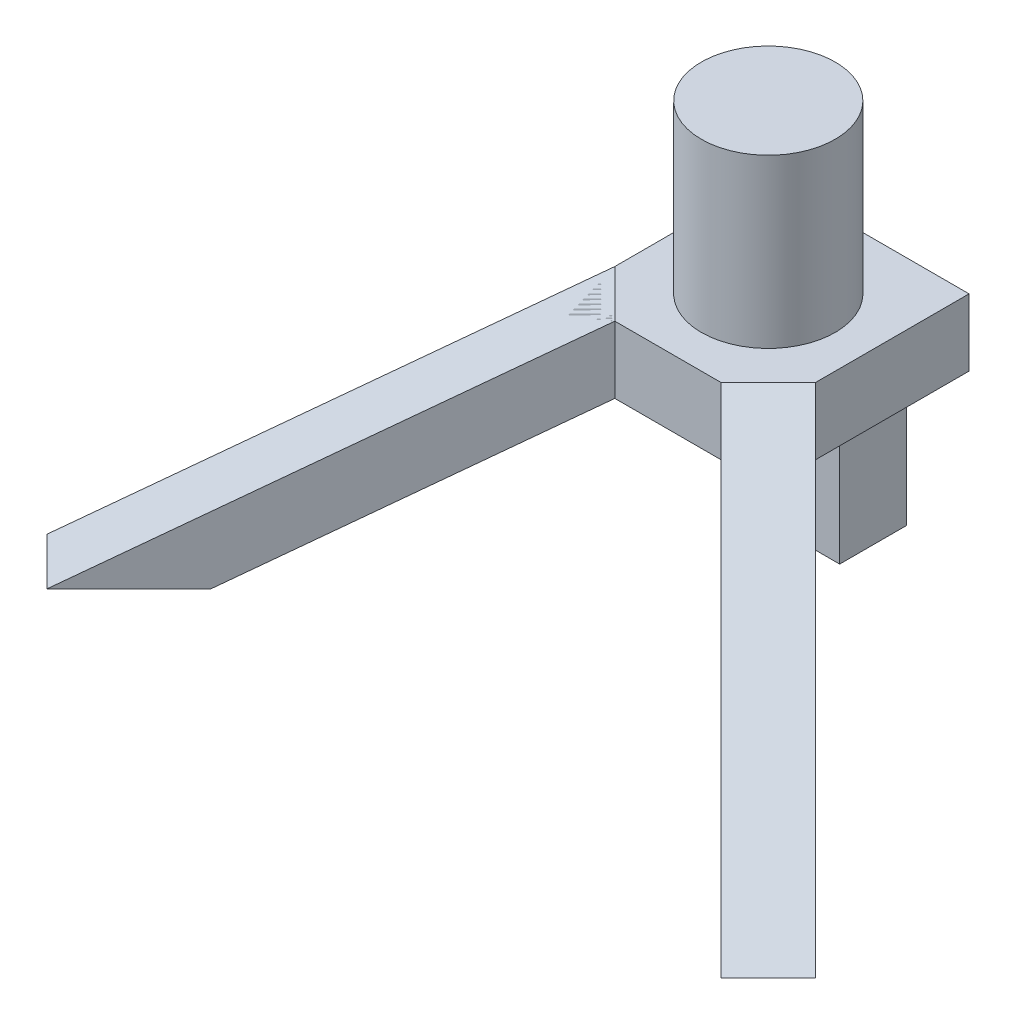
ISO-10303-21;
HEADER;
FILE_DESCRIPTION(('STEP AP214'),'2;1');
FILE_NAME('part.step','',(''),(''),'','','');
FILE_SCHEMA(('AUTOMOTIVE_DESIGN { 1 0 10303 214 1 1 1 1 }'));
ENDSEC;
DATA;
#1=APPLICATION_CONTEXT('core data for automotive mechanical design processes');
#2=APPLICATION_PROTOCOL_DEFINITION('international standard','automotive_design',2000,#1);
#3=PRODUCT_CONTEXT('',#1,'mechanical');
#4=PRODUCT('Part','Part','',(#3));
#5=PRODUCT_RELATED_PRODUCT_CATEGORY('part','',(#4));
#6=PRODUCT_DEFINITION_FORMATION('','',#4);
#7=PRODUCT_DEFINITION_CONTEXT('part definition',#1,'design');
#8=PRODUCT_DEFINITION('design','',#6,#7);
#9=PRODUCT_DEFINITION_SHAPE('','',#8);
#10=(LENGTH_UNIT() NAMED_UNIT(*) SI_UNIT(.MILLI.,.METRE.));
#11=(NAMED_UNIT(*) PLANE_ANGLE_UNIT() SI_UNIT($,.RADIAN.));
#12=(NAMED_UNIT(*) SI_UNIT($,.STERADIAN.) SOLID_ANGLE_UNIT());
#13=UNCERTAINTY_MEASURE_WITH_UNIT(LENGTH_MEASURE(1.E-05),#10,'distance_accuracy_value','');
#14=(GEOMETRIC_REPRESENTATION_CONTEXT(3) GLOBAL_UNCERTAINTY_ASSIGNED_CONTEXT((#13)) GLOBAL_UNIT_ASSIGNED_CONTEXT((#10,
#11,#12)) REPRESENTATION_CONTEXT('',''));
#15=CARTESIAN_POINT('',(0.,0.,0.));
#16=DIRECTION('',(0.,0.,1.));
#17=DIRECTION('',(1.,0.,0.));
#18=AXIS2_PLACEMENT_3D('',#15,#16,#17);
#19=CARTESIAN_POINT('',(-30.,20.,15.857864376269));
#20=DIRECTION('',(-0.707106781186547,0.,0.707106781186548));
#21=DIRECTION('',(0.707106781186548,0.,0.707106781186547));
#22=AXIS2_PLACEMENT_3D('',#19,#20,#21);
#23=PLANE('',#22);
#24=DIRECTION('',(0.707106781186548,0.,0.707106781186547));
#25=VECTOR('',#24,1.);
#26=CARTESIAN_POINT('',(-30.,20.,15.857864376269));
#27=LINE('',#26,#25);
#28=CARTESIAN_POINT('',(-30.,20.,15.857864376269));
#29=VERTEX_POINT('',#28);
#30=CARTESIAN_POINT('',(-15.857864376269,20.,30.));
#31=VERTEX_POINT('',#30);
#32=EDGE_CURVE('E71',#29,#31,#27,.T.);
#33=ORIENTED_EDGE('',*,*,#32,.T.);
#34=DIRECTION('',(0.,-1.,0.));
#35=VECTOR('',#34,1.);
#36=CARTESIAN_POINT('',(-15.857864376269,20.,30.));
#37=LINE('',#36,#35);
#38=CARTESIAN_POINT('',(-15.857864376269,0.,30.));
#39=VERTEX_POINT('',#38);
#40=EDGE_CURVE('E111',#31,#39,#37,.T.);
#41=ORIENTED_EDGE('',*,*,#40,.T.);
#42=DIRECTION('',(0.707106781186548,0.,0.707106781186547));
#43=VECTOR('',#42,1.);
#44=CARTESIAN_POINT('',(-30.,0.,15.857864376269));
#45=LINE('',#44,#43);
#46=CARTESIAN_POINT('',(-30.,0.,15.857864376269));
#47=VERTEX_POINT('',#46);
#48=EDGE_CURVE('E12',#47,#39,#45,.T.);
#49=ORIENTED_EDGE('',*,*,#48,.F.);
#50=DIRECTION('',(0.,-1.,0.));
#51=VECTOR('',#50,1.);
#52=CARTESIAN_POINT('',(-30.,20.,15.857864376269));
#53=LINE('',#52,#51);
#54=EDGE_CURVE('E119',#29,#47,#53,.T.);
#55=ORIENTED_EDGE('',*,*,#54,.F.);
#56=EDGE_LOOP('',(#33,#41,#49,#55));
#57=FACE_BOUND('',#56,.T.);
#58=ADVANCED_FACE('F57',(#57),#23,.F.);
#59=CARTESIAN_POINT('',(-30.,0.,15.857864376269));
#60=DIRECTION('',(-0.353553390593272,0.86602540378444,0.353553390593273));
#61=DIRECTION('',(0.,-0.377964473009226,0.925820099772552));
#62=AXIS2_PLACEMENT_3D('',#59,#60,#61);
#63=PLANE('',#62);
#64=ORIENTED_EDGE('',*,*,#48,.T.);
#65=DIRECTION('',(-0.612372435695795,-0.499999999999998,0.612372435695796));
#66=VECTOR('',#65,1.);
#67=CARTESIAN_POINT('',(-15.857864376269,0.,30.));
#68=LINE('',#67,#66);
#69=CARTESIAN_POINT('',(-76.2157806908228,-49.2820323027547,90.3579163145538));
#70=VERTEX_POINT('',#69);
#71=EDGE_CURVE('E101',#39,#70,#68,.T.);
#72=ORIENTED_EDGE('',*,*,#71,.T.);
#73=DIRECTION('',(0.707106781186548,0.,0.707106781186547));
#74=VECTOR('',#73,1.);
#75=CARTESIAN_POINT('',(-90.3579163145537,-49.2820323027547,76.2157806908229));
#76=LINE('',#75,#74);
#77=CARTESIAN_POINT('',(-90.3579163145537,-49.2820323027547,76.2157806908229));
#78=VERTEX_POINT('',#77);
#79=EDGE_CURVE('E64',#78,#70,#76,.T.);
#80=ORIENTED_EDGE('',*,*,#79,.F.);
#81=DIRECTION('',(-0.612372435695795,-0.499999999999998,0.612372435695796));
#82=VECTOR('',#81,1.);
#83=CARTESIAN_POINT('',(-30.,0.,15.857864376269));
#84=LINE('',#83,#82);
#85=EDGE_CURVE('E102',#47,#78,#84,.T.);
#86=ORIENTED_EDGE('',*,*,#85,.F.);
#87=EDGE_LOOP('',(#64,#72,#80,#86));
#88=FACE_BOUND('',#87,.T.);
#89=ADVANCED_FACE('F99',(#88),#63,.F.);
#90=CARTESIAN_POINT('',(-114.852813742386,-49.2820323027547,100.710678118655));
#91=DIRECTION('',(0.,-1.,0.));
#92=DIRECTION('',(0.,0.,-1.));
#93=AXIS2_PLACEMENT_3D('',#90,#91,#92);
#94=PLANE('',#93);
#95=ORIENTED_EDGE('',*,*,#79,.T.);
#96=DIRECTION('',(0.707106781186547,0.,-0.707106781186548));
#97=VECTOR('',#96,1.);
#98=CARTESIAN_POINT('',(-100.710678118655,-49.2820323027547,114.852813742386));
#99=LINE('',#98,#97);
#100=CARTESIAN_POINT('',(-100.710678118655,-49.2820323027547,114.852813742386));
#101=VERTEX_POINT('',#100);
#102=EDGE_CURVE('E112',#101,#70,#99,.T.);
#103=ORIENTED_EDGE('',*,*,#102,.F.);
#104=DIRECTION('',(0.707106781186548,0.,0.707106781186547));
#105=VECTOR('',#104,1.);
#106=CARTESIAN_POINT('',(-114.852813742386,-49.2820323027547,100.710678118655));
#107=LINE('',#106,#105);
#108=CARTESIAN_POINT('',(-114.852813742386,-49.2820323027547,100.710678118655));
#109=VERTEX_POINT('',#108);
#110=EDGE_CURVE('E79',#109,#101,#107,.T.);
#111=ORIENTED_EDGE('',*,*,#110,.F.);
#112=DIRECTION('',(0.707106781186547,0.,-0.707106781186548));
#113=VECTOR('',#112,1.);
#114=CARTESIAN_POINT('',(-114.852813742386,-49.2820323027547,100.710678118655));
#115=LINE('',#114,#113);
#116=EDGE_CURVE('E122',#109,#78,#115,.T.);
#117=ORIENTED_EDGE('',*,*,#116,.T.);
#118=EDGE_LOOP('',(#95,#103,#111,#117));
#119=FACE_BOUND('',#118,.T.);
#120=ADVANCED_FACE('F127',(#119),#94,.T.);
#121=CARTESIAN_POINT('',(-30.,20.,15.857864376269));
#122=DIRECTION('',(-0.353553390593272,0.86602540378444,0.353553390593273));
#123=DIRECTION('',(0.,-0.377964473009226,0.925820099772552));
#124=AXIS2_PLACEMENT_3D('',#121,#122,#123);
#125=PLANE('',#124);
#126=ORIENTED_EDGE('',*,*,#110,.T.);
#127=DIRECTION('',(-0.612372435695795,-0.499999999999998,0.612372435695796));
#128=VECTOR('',#127,1.);
#129=CARTESIAN_POINT('',(-15.857864376269,20.,30.));
#130=LINE('',#129,#128);
#131=EDGE_CURVE('E117',#31,#101,#130,.T.);
#132=ORIENTED_EDGE('',*,*,#131,.F.);
#133=ORIENTED_EDGE('',*,*,#32,.F.);
#134=DIRECTION('',(-0.612372435695795,-0.499999999999998,0.612372435695796));
#135=VECTOR('',#134,1.);
#136=CARTESIAN_POINT('',(-30.,20.,15.857864376269));
#137=LINE('',#136,#135);
#138=EDGE_CURVE('E124',#29,#109,#137,.T.);
#139=ORIENTED_EDGE('',*,*,#138,.T.);
#140=EDGE_LOOP('',(#126,#132,#133,#139));
#141=FACE_BOUND('',#140,.T.);
#142=ADVANCED_FACE('F131',(#141),#125,.T.);
#143=CARTESIAN_POINT('',(-7.07106781186547,0.,-7.07106781186547));
#144=DIRECTION('',(0.707106781186548,0.,0.707106781186547));
#145=DIRECTION('',(0.707106781186547,0.,-0.707106781186548));
#146=AXIS2_PLACEMENT_3D('',#143,#144,#145);
#147=PLANE('',#146);
#148=ORIENTED_EDGE('',*,*,#54,.T.);
#149=ORIENTED_EDGE('',*,*,#85,.T.);
#150=ORIENTED_EDGE('',*,*,#116,.F.);
#151=ORIENTED_EDGE('',*,*,#138,.F.);
#152=EDGE_LOOP('',(#148,#149,#150,#151));
#153=FACE_BOUND('',#152,.T.);
#154=ADVANCED_FACE('F130',(#153),#147,.F.);
#155=CARTESIAN_POINT('',(7.07106781186548,0.,7.07106781186548));
#156=DIRECTION('',(0.707106781186548,0.,0.707106781186547));
#157=DIRECTION('',(0.707106781186547,0.,-0.707106781186548));
#158=AXIS2_PLACEMENT_3D('',#155,#156,#157);
#159=PLANE('',#158);
#160=ORIENTED_EDGE('',*,*,#40,.F.);
#161=ORIENTED_EDGE('',*,*,#131,.T.);
#162=ORIENTED_EDGE('',*,*,#102,.T.);
#163=ORIENTED_EDGE('',*,*,#71,.F.);
#164=EDGE_LOOP('',(#160,#161,#162,#163));
#165=FACE_BOUND('',#164,.T.);
#166=ADVANCED_FACE('F109',(#165),#159,.T.);
#167=CLOSED_SHELL('',(#58,#89,#120,#142,#154,#166));
#168=MANIFOLD_SOLID_BREP('B2',#167);
#169=CARTESIAN_POINT('',(0.,0.,0.));
#170=DIRECTION('',(0.,1.,0.));
#171=DIRECTION('',(0.,0.,1.));
#172=AXIS2_PLACEMENT_3D('',#169,#170,#171);
#173=PLANE('',#172);
#174=DIRECTION('',(0.,0.,-1.));
#175=VECTOR('',#174,1.);
#176=CARTESIAN_POINT('',(-8.66595206494777,0.,-30.));
#177=LINE('',#176,#175);
#178=CARTESIAN_POINT('',(-8.66595206494777,0.,-10.));
#179=VERTEX_POINT('',#178);
#180=CARTESIAN_POINT('',(-8.66595206494777,0.,-30.));
#181=VERTEX_POINT('',#180);
#182=EDGE_CURVE('E198',#179,#181,#177,.T.);
#183=ORIENTED_EDGE('',*,*,#182,.F.);
#184=DIRECTION('',(-1.,0.,0.));
#185=VECTOR('',#184,1.);
#186=CARTESIAN_POINT('',(-8.66595206494777,0.,-10.));
#187=LINE('',#186,#185);
#188=CARTESIAN_POINT('',(11.3340479350522,0.,-10.));
#189=VERTEX_POINT('',#188);
#190=EDGE_CURVE('E203',#189,#179,#187,.T.);
#191=ORIENTED_EDGE('',*,*,#190,.F.);
#192=DIRECTION('',(0.,0.,1.));
#193=VECTOR('',#192,1.);
#194=CARTESIAN_POINT('',(11.3340479350522,0.,-30.));
#195=LINE('',#194,#193);
#196=CARTESIAN_POINT('',(11.3340479350522,0.,-30.));
#197=VERTEX_POINT('',#196);
#198=EDGE_CURVE('E278',#197,#189,#195,.T.);
#199=ORIENTED_EDGE('',*,*,#198,.F.);
#200=DIRECTION('',(1.,0.,0.));
#201=VECTOR('',#200,1.);
#202=CARTESIAN_POINT('',(0.,0.,-30.));
#203=LINE('',#202,#201);
#204=CARTESIAN_POINT('',(30.,0.,-30.));
#205=VERTEX_POINT('',#204);
#206=EDGE_CURVE('E368',#197,#205,#203,.T.);
#207=ORIENTED_EDGE('',*,*,#206,.T.);
#208=DIRECTION('',(0.,0.,-1.));
#209=VECTOR('',#208,1.);
#210=CARTESIAN_POINT('',(30.,0.,0.));
#211=LINE('',#210,#209);
#212=CARTESIAN_POINT('',(30.,0.,15.857864376269));
#213=VERTEX_POINT('',#212);
#214=EDGE_CURVE('E375',#213,#205,#211,.T.);
#215=ORIENTED_EDGE('',*,*,#214,.F.);
#216=DIRECTION('',(-0.707106781186548,0.,0.707106781186547));
#217=VECTOR('',#216,1.);
#218=CARTESIAN_POINT('',(30.,0.,15.857864376269));
#219=LINE('',#218,#217);
#220=CARTESIAN_POINT('',(15.8578643762691,0.,30.));
#221=VERTEX_POINT('',#220);
#222=EDGE_CURVE('E330',#213,#221,#219,.T.);
#223=ORIENTED_EDGE('',*,*,#222,.T.);
#224=DIRECTION('',(1.,0.,0.));
#225=VECTOR('',#224,1.);
#226=CARTESIAN_POINT('',(0.,0.,30.));
#227=LINE('',#226,#225);
#228=CARTESIAN_POINT('',(-30.,0.,30.));
#229=VERTEX_POINT('',#228);
#230=EDGE_CURVE('E392',#229,#221,#227,.T.);
#231=ORIENTED_EDGE('',*,*,#230,.F.);
#232=DIRECTION('',(0.,0.,-1.));
#233=VECTOR('',#232,1.);
#234=CARTESIAN_POINT('',(-30.,0.,0.));
#235=LINE('',#234,#233);
#236=CARTESIAN_POINT('',(-30.,0.,-30.));
#237=VERTEX_POINT('',#236);
#238=EDGE_CURVE('E388',#229,#237,#235,.T.);
#239=ORIENTED_EDGE('',*,*,#238,.T.);
#240=EDGE_CURVE('E385',#237,#181,#203,.T.);
#241=ORIENTED_EDGE('',*,*,#240,.T.);
#242=EDGE_LOOP('',(#183,#191,#199,#207,#215,#223,#231,#239,#241));
#243=FACE_BOUND('',#242,.T.);
#244=ADVANCED_FACE('F181',(#243),#173,.F.);
#245=CARTESIAN_POINT('',(-30.,20.,0.));
#246=DIRECTION('',(-1.,0.,0.));
#247=DIRECTION('',(0.,0.,1.));
#248=AXIS2_PLACEMENT_3D('',#245,#246,#247);
#249=PLANE('',#248);
#250=DIRECTION('',(0.,-1.,0.));
#251=VECTOR('',#250,1.);
#252=CARTESIAN_POINT('',(-30.,20.,30.));
#253=LINE('',#252,#251);
#254=CARTESIAN_POINT('',(-30.,14.2264973081038,30.));
#255=VERTEX_POINT('',#254);
#256=EDGE_CURVE('E401',#255,#229,#253,.T.);
#257=ORIENTED_EDGE('',*,*,#256,.F.);
#258=DIRECTION('',(0.,0.377964473009226,-0.925820099772552));
#259=VECTOR('',#258,1.);
#260=CARTESIAN_POINT('',(-30.,25.5490965903026,2.26540919660988));
#261=LINE('',#260,#259);
#262=CARTESIAN_POINT('',(-30.,20.,15.857864376269));
#263=VERTEX_POINT('',#262);
#264=EDGE_CURVE('E319',#255,#263,#261,.T.);
#265=ORIENTED_EDGE('',*,*,#264,.T.);
#266=DIRECTION('',(0.,0.,-1.));
#267=VECTOR('',#266,1.);
#268=CARTESIAN_POINT('',(-30.,20.,0.));
#269=LINE('',#268,#267);
#270=CARTESIAN_POINT('',(-30.,20.,-30.));
#271=VERTEX_POINT('',#270);
#272=EDGE_CURVE('E374',#263,#271,#269,.T.);
#273=ORIENTED_EDGE('',*,*,#272,.T.);
#274=DIRECTION('',(0.,-1.,0.));
#275=VECTOR('',#274,1.);
#276=CARTESIAN_POINT('',(-30.,20.,-30.));
#277=LINE('',#276,#275);
#278=EDGE_CURVE('E185',#271,#237,#277,.T.);
#279=ORIENTED_EDGE('',*,*,#278,.T.);
#280=ORIENTED_EDGE('',*,*,#238,.F.);
#281=EDGE_LOOP('',(#257,#265,#273,#279,#280));
#282=FACE_BOUND('',#281,.T.);
#283=ADVANCED_FACE('F412',(#282),#249,.T.);
#284=CARTESIAN_POINT('',(0.,20.,30.));
#285=DIRECTION('',(0.,0.,-1.));
#286=DIRECTION('',(-1.,0.,0.));
#287=AXIS2_PLACEMENT_3D('',#284,#285,#286);
#288=PLANE('',#287);
#289=DIRECTION('',(0.925820099772552,0.377964473009225,0.));
#290=VECTOR('',#289,1.);
#291=CARTESIAN_POINT('',(-2.26540919660984,25.5490965903025,30.));
#292=LINE('',#291,#290);
#293=CARTESIAN_POINT('',(-15.8578643762691,20.,30.));
#294=VERTEX_POINT('',#293);
#295=EDGE_CURVE('E300',#255,#294,#292,.T.);
#296=ORIENTED_EDGE('',*,*,#295,.F.);
#297=ORIENTED_EDGE('',*,*,#256,.T.);
#298=ORIENTED_EDGE('',*,*,#230,.T.);
#299=DIRECTION('',(0.,-1.,0.));
#300=VECTOR('',#299,1.);
#301=CARTESIAN_POINT('',(15.857864376269,20.,30.));
#302=LINE('',#301,#300);
#303=CARTESIAN_POINT('',(15.857864376269,20.,30.));
#304=VERTEX_POINT('',#303);
#305=EDGE_CURVE('E326',#304,#221,#302,.T.);
#306=ORIENTED_EDGE('',*,*,#305,.F.);
#307=DIRECTION('',(1.,0.,0.));
#308=VECTOR('',#307,1.);
#309=CARTESIAN_POINT('',(0.,20.,30.));
#310=LINE('',#309,#308);
#311=EDGE_CURVE('E378',#294,#304,#310,.T.);
#312=ORIENTED_EDGE('',*,*,#311,.F.);
#313=EDGE_LOOP('',(#296,#297,#298,#306,#312));
#314=FACE_BOUND('',#313,.T.);
#315=ADVANCED_FACE('F420',(#314),#288,.F.);
#316=CARTESIAN_POINT('',(0.,20.,0.));
#317=DIRECTION('',(0.,1.,0.));
#318=DIRECTION('',(0.,0.,1.));
#319=AXIS2_PLACEMENT_3D('',#316,#317,#318);
#320=PLANE('',#319);
#321=CARTESIAN_POINT('',(0.,20.,0.));
#322=DIRECTION('',(0.,1.,0.));
#323=DIRECTION('',(0.,0.,1.));
#324=AXIS2_PLACEMENT_3D('',#321,#322,#323);
#325=CIRCLE('',#324,19.9999999999999);
#326=CARTESIAN_POINT('',(0.,20.,19.9999999999999));
#327=VERTEX_POINT('',#326);
#328=EDGE_CURVE('E55',#327,#327,#325,.T.);
#329=ORIENTED_EDGE('',*,*,#328,.F.);
#330=EDGE_LOOP('',(#329));
#331=FACE_BOUND('',#330,.T.);
#332=ORIENTED_EDGE('',*,*,#272,.F.);
#333=DIRECTION('',(-0.707106781186548,0.,-0.707106781186547));
#334=VECTOR('',#333,1.);
#335=CARTESIAN_POINT('',(-15.857864376269,20.,30.));
#336=LINE('',#335,#334);
#337=EDGE_CURVE('E296',#294,#263,#336,.T.);
#338=ORIENTED_EDGE('',*,*,#337,.F.);
#339=ORIENTED_EDGE('',*,*,#311,.T.);
#340=DIRECTION('',(0.707106781186548,0.,-0.707106781186547));
#341=VECTOR('',#340,1.);
#342=CARTESIAN_POINT('',(15.857864376269,20.,30.));
#343=LINE('',#342,#341);
#344=CARTESIAN_POINT('',(30.,20.,15.857864376269));
#345=VERTEX_POINT('',#344);
#346=EDGE_CURVE('E323',#304,#345,#343,.T.);
#347=ORIENTED_EDGE('',*,*,#346,.T.);
#348=DIRECTION('',(0.,0.,-1.));
#349=VECTOR('',#348,1.);
#350=CARTESIAN_POINT('',(30.,20.,0.));
#351=LINE('',#350,#349);
#352=CARTESIAN_POINT('',(30.,20.,-30.));
#353=VERTEX_POINT('',#352);
#354=EDGE_CURVE('E381',#345,#353,#351,.T.);
#355=ORIENTED_EDGE('',*,*,#354,.T.);
#356=DIRECTION('',(1.,0.,0.));
#357=VECTOR('',#356,1.);
#358=CARTESIAN_POINT('',(0.,20.,-30.));
#359=LINE('',#358,#357);
#360=EDGE_CURVE('E370',#271,#353,#359,.T.);
#361=ORIENTED_EDGE('',*,*,#360,.F.);
#362=EDGE_LOOP('',(#332,#338,#339,#347,#355,#361));
#363=FACE_BOUND('',#362,.T.);
#364=ADVANCED_FACE('F438',(#331,#363),#320,.T.);
#365=CARTESIAN_POINT('',(30.,20.,0.));
#366=DIRECTION('',(-1.,0.,0.));
#367=DIRECTION('',(0.,0.,1.));
#368=AXIS2_PLACEMENT_3D('',#365,#366,#367);
#369=PLANE('',#368);
#370=DIRECTION('',(0.,-1.,0.));
#371=VECTOR('',#370,1.);
#372=CARTESIAN_POINT('',(30.,20.,15.857864376269));
#373=LINE('',#372,#371);
#374=EDGE_CURVE('E333',#345,#213,#373,.T.);
#375=ORIENTED_EDGE('',*,*,#374,.T.);
#376=ORIENTED_EDGE('',*,*,#214,.T.);
#377=DIRECTION('',(0.,-1.,0.));
#378=VECTOR('',#377,1.);
#379=CARTESIAN_POINT('',(30.,20.,-30.));
#380=LINE('',#379,#378);
#381=EDGE_CURVE('E384',#353,#205,#380,.T.);
#382=ORIENTED_EDGE('',*,*,#381,.F.);
#383=ORIENTED_EDGE('',*,*,#354,.F.);
#384=EDGE_LOOP('',(#375,#376,#382,#383));
#385=FACE_BOUND('',#384,.T.);
#386=ADVANCED_FACE('F442',(#385),#369,.F.);
#387=CARTESIAN_POINT('',(0.,20.,-30.));
#388=DIRECTION('',(0.,0.,-1.));
#389=DIRECTION('',(-1.,0.,0.));
#390=AXIS2_PLACEMENT_3D('',#387,#388,#389);
#391=PLANE('',#390);
#392=ORIENTED_EDGE('',*,*,#240,.F.);
#393=ORIENTED_EDGE('',*,*,#278,.F.);
#394=ORIENTED_EDGE('',*,*,#360,.T.);
#395=ORIENTED_EDGE('',*,*,#381,.T.);
#396=ORIENTED_EDGE('',*,*,#206,.F.);
#397=DIRECTION('',(0.,1.,0.));
#398=VECTOR('',#397,1.);
#399=CARTESIAN_POINT('',(11.3340479350522,-77.5663035502167,-30.));
#400=LINE('',#399,#398);
#401=CARTESIAN_POINT('',(11.3340479350522,-49.2820323027548,-30.));
#402=VERTEX_POINT('',#401);
#403=EDGE_CURVE('E312',#402,#197,#400,.T.);
#404=ORIENTED_EDGE('',*,*,#403,.F.);
#405=DIRECTION('',(1.,0.,0.));
#406=VECTOR('',#405,1.);
#407=CARTESIAN_POINT('',(-8.66595206494779,-49.2820323027548,-30.));
#408=LINE('',#407,#406);
#409=CARTESIAN_POINT('',(-8.66595206494777,-49.2820323027548,-30.));
#410=VERTEX_POINT('',#409);
#411=EDGE_CURVE('E294',#410,#402,#408,.T.);
#412=ORIENTED_EDGE('',*,*,#411,.F.);
#413=DIRECTION('',(0.,1.,0.));
#414=VECTOR('',#413,1.);
#415=CARTESIAN_POINT('',(-8.66595206494777,-77.5663035502167,-30.));
#416=LINE('',#415,#414);
#417=EDGE_CURVE('E308',#410,#181,#416,.T.);
#418=ORIENTED_EDGE('',*,*,#417,.T.);
#419=EDGE_LOOP('',(#392,#393,#394,#395,#396,#404,#412,#418));
#420=FACE_BOUND('',#419,.T.);
#421=ADVANCED_FACE('F183',(#420),#391,.T.);
#422=CARTESIAN_POINT('',(0.,70.,0.));
#423=DIRECTION('',(0.,-1.,0.));
#424=DIRECTION('',(0.,0.,-1.));
#425=AXIS2_PLACEMENT_3D('',#422,#423,#424);
#426=CYLINDRICAL_SURFACE('',#425,19.9999999999999);
#427=CARTESIAN_POINT('',(0.,70.,0.));
#428=DIRECTION('',(0.,1.,0.));
#429=DIRECTION('',(0.,0.,1.));
#430=AXIS2_PLACEMENT_3D('',#427,#428,#429);
#431=CIRCLE('',#430,19.9999999999999);
#432=CARTESIAN_POINT('',(0.,70.,19.9999999999999));
#433=VERTEX_POINT('',#432);
#434=EDGE_CURVE('E365',#433,#433,#431,.T.);
#435=ORIENTED_EDGE('',*,*,#434,.F.);
#436=EDGE_LOOP('',(#435));
#437=FACE_BOUND('',#436,.T.);
#438=ORIENTED_EDGE('',*,*,#328,.T.);
#439=EDGE_LOOP('',(#438));
#440=FACE_BOUND('',#439,.T.);
#441=ADVANCED_FACE('F479',(#437,#440),#426,.T.);
#442=CARTESIAN_POINT('',(0.,70.,0.));
#443=DIRECTION('',(0.,1.,0.));
#444=DIRECTION('',(0.,0.,1.));
#445=AXIS2_PLACEMENT_3D('',#442,#443,#444);
#446=PLANE('',#445);
#447=ORIENTED_EDGE('',*,*,#434,.T.);
#448=EDGE_LOOP('',(#447));
#449=FACE_BOUND('',#448,.T.);
#450=ADVANCED_FACE('F481',(#449),#446,.T.);
#451=CARTESIAN_POINT('',(30.,20.,15.857864376269));
#452=DIRECTION('',(0.353553390593272,0.86602540378444,0.353553390593273));
#453=DIRECTION('',(0.,-0.377964473009226,0.925820099772552));
#454=AXIS2_PLACEMENT_3D('',#451,#452,#453);
#455=PLANE('',#454);
#456=DIRECTION('',(0.612372435695795,-0.499999999999998,0.612372435695796));
#457=VECTOR('',#456,1.);
#458=CARTESIAN_POINT('',(30.,20.,15.857864376269));
#459=LINE('',#458,#457);
#460=CARTESIAN_POINT('',(114.852813742386,-49.2820323027547,100.710678118655));
#461=VERTEX_POINT('',#460);
#462=EDGE_CURVE('E362',#345,#461,#459,.T.);
#463=ORIENTED_EDGE('',*,*,#462,.F.);
#464=ORIENTED_EDGE('',*,*,#346,.F.);
#465=DIRECTION('',(0.612372435695795,-0.499999999999998,0.612372435695796));
#466=VECTOR('',#465,1.);
#467=CARTESIAN_POINT('',(15.857864376269,20.,30.));
#468=LINE('',#467,#466);
#469=CARTESIAN_POINT('',(100.710678118655,-49.2820323027547,114.852813742386));
#470=VERTEX_POINT('',#469);
#471=EDGE_CURVE('E359',#304,#470,#468,.T.);
#472=ORIENTED_EDGE('',*,*,#471,.T.);
#473=DIRECTION('',(-0.707106781186548,0.,0.707106781186547));
#474=VECTOR('',#473,1.);
#475=CARTESIAN_POINT('',(114.852813742386,-49.2820323027547,100.710678118655));
#476=LINE('',#475,#474);
#477=EDGE_CURVE('E352',#461,#470,#476,.T.);
#478=ORIENTED_EDGE('',*,*,#477,.F.);
#479=EDGE_LOOP('',(#463,#464,#472,#478));
#480=FACE_BOUND('',#479,.T.);
#481=ADVANCED_FACE('F433',(#480),#455,.T.);
#482=CARTESIAN_POINT('',(30.,0.,15.857864376269));
#483=DIRECTION('',(0.353553390593272,0.86602540378444,0.353553390593273));
#484=DIRECTION('',(0.,-0.377964473009226,0.925820099772552));
#485=AXIS2_PLACEMENT_3D('',#482,#483,#484);
#486=PLANE('',#485);
#487=ORIENTED_EDGE('',*,*,#222,.F.);
#488=DIRECTION('',(0.612372435695795,-0.499999999999998,0.612372435695796));
#489=VECTOR('',#488,1.);
#490=CARTESIAN_POINT('',(30.,0.,15.857864376269));
#491=LINE('',#490,#489);
#492=CARTESIAN_POINT('',(90.3579163145537,-49.2820323027547,76.2157806908229));
#493=VERTEX_POINT('',#492);
#494=EDGE_CURVE('E345',#213,#493,#491,.T.);
#495=ORIENTED_EDGE('',*,*,#494,.T.);
#496=DIRECTION('',(-0.707106781186548,0.,0.707106781186547));
#497=VECTOR('',#496,1.);
#498=CARTESIAN_POINT('',(90.3579163145537,-49.2820323027547,76.2157806908229));
#499=LINE('',#498,#497);
#500=CARTESIAN_POINT('',(76.2157806908228,-49.2820323027547,90.3579163145538));
#501=VERTEX_POINT('',#500);
#502=EDGE_CURVE('E341',#493,#501,#499,.T.);
#503=ORIENTED_EDGE('',*,*,#502,.T.);
#504=DIRECTION('',(0.612372435695795,-0.499999999999998,0.612372435695796));
#505=VECTOR('',#504,1.);
#506=CARTESIAN_POINT('',(15.857864376269,0.,30.));
#507=LINE('',#506,#505);
#508=EDGE_CURVE('E337',#221,#501,#507,.T.);
#509=ORIENTED_EDGE('',*,*,#508,.F.);
#510=EDGE_LOOP('',(#487,#495,#503,#509));
#511=FACE_BOUND('',#510,.T.);
#512=ADVANCED_FACE('F424',(#511),#486,.F.);
#513=CARTESIAN_POINT('',(114.852813742386,-49.2820323027547,100.710678118655));
#514=DIRECTION('',(0.,-1.,0.));
#515=DIRECTION('',(0.,0.,-1.));
#516=AXIS2_PLACEMENT_3D('',#513,#514,#515);
#517=PLANE('',#516);
#518=ORIENTED_EDGE('',*,*,#502,.F.);
#519=DIRECTION('',(-0.707106781186547,0.,-0.707106781186548));
#520=VECTOR('',#519,1.);
#521=CARTESIAN_POINT('',(114.852813742386,-49.2820323027547,100.710678118655));
#522=LINE('',#521,#520);
#523=EDGE_CURVE('E356',#461,#493,#522,.T.);
#524=ORIENTED_EDGE('',*,*,#523,.F.);
#525=ORIENTED_EDGE('',*,*,#477,.T.);
#526=DIRECTION('',(-0.707106781186547,0.,-0.707106781186548));
#527=VECTOR('',#526,1.);
#528=CARTESIAN_POINT('',(100.710678118655,-49.2820323027547,114.852813742386));
#529=LINE('',#528,#527);
#530=EDGE_CURVE('E349',#470,#501,#529,.T.);
#531=ORIENTED_EDGE('',*,*,#530,.T.);
#532=EDGE_LOOP('',(#518,#524,#525,#531));
#533=FACE_BOUND('',#532,.T.);
#534=ADVANCED_FACE('F492',(#533),#517,.T.);
#535=CARTESIAN_POINT('',(7.07106781186547,0.,-7.07106781186547));
#536=DIRECTION('',(-0.707106781186548,0.,0.707106781186547));
#537=DIRECTION('',(-0.707106781186547,0.,-0.707106781186548));
#538=AXIS2_PLACEMENT_3D('',#535,#536,#537);
#539=PLANE('',#538);
#540=ORIENTED_EDGE('',*,*,#374,.F.);
#541=ORIENTED_EDGE('',*,*,#462,.T.);
#542=ORIENTED_EDGE('',*,*,#523,.T.);
#543=ORIENTED_EDGE('',*,*,#494,.F.);
#544=EDGE_LOOP('',(#540,#541,#542,#543));
#545=FACE_BOUND('',#544,.T.);
#546=ADVANCED_FACE('F457',(#545),#539,.F.);
#547=CARTESIAN_POINT('',(-7.07106781186548,0.,7.07106781186548));
#548=DIRECTION('',(-0.707106781186548,0.,0.707106781186547));
#549=DIRECTION('',(-0.707106781186547,0.,-0.707106781186548));
#550=AXIS2_PLACEMENT_3D('',#547,#548,#549);
#551=PLANE('',#550);
#552=ORIENTED_EDGE('',*,*,#305,.T.);
#553=ORIENTED_EDGE('',*,*,#508,.T.);
#554=ORIENTED_EDGE('',*,*,#530,.F.);
#555=ORIENTED_EDGE('',*,*,#471,.F.);
#556=EDGE_LOOP('',(#552,#553,#554,#555));
#557=FACE_BOUND('',#556,.T.);
#558=ADVANCED_FACE('F428',(#557),#551,.T.);
#559=CARTESIAN_POINT('',(-11.8559574039915,29.0410460519517,11.8559574039915));
#560=DIRECTION('',(-0.353553390593272,0.86602540378444,0.353553390593273));
#561=DIRECTION('',(0.,-0.377964473009226,0.925820099772552));
#562=AXIS2_PLACEMENT_3D('',#559,#560,#561);
#563=PLANE('',#562);
#564=ORIENTED_EDGE('',*,*,#295,.T.);
#565=ORIENTED_EDGE('',*,*,#337,.T.);
#566=ORIENTED_EDGE('',*,*,#264,.F.);
#567=EDGE_LOOP('',(#564,#565,#566));
#568=FACE_BOUND('',#567,.T.);
#569=ADVANCED_FACE('F445',(#568),#563,.T.);
#570=CARTESIAN_POINT('',(-8.66595206494777,-77.5663035502167,-30.));
#571=DIRECTION('',(1.,0.,0.));
#572=DIRECTION('',(0.,0.,-1.));
#573=AXIS2_PLACEMENT_3D('',#570,#571,#572);
#574=PLANE('',#573);
#575=DIRECTION('',(0.,0.,-1.));
#576=VECTOR('',#575,1.);
#577=CARTESIAN_POINT('',(-8.66595206494777,-49.2820323027548,-30.));
#578=LINE('',#577,#576);
#579=CARTESIAN_POINT('',(-8.66595206494777,-49.2820323027548,-10.));
#580=VERTEX_POINT('',#579);
#581=EDGE_CURVE('E290',#580,#410,#578,.T.);
#582=ORIENTED_EDGE('',*,*,#581,.F.);
#583=DIRECTION('',(0.,1.,0.));
#584=VECTOR('',#583,1.);
#585=CARTESIAN_POINT('',(-8.66595206494777,-77.5663035502167,-10.));
#586=LINE('',#585,#584);
#587=EDGE_CURVE('E285',#580,#179,#586,.T.);
#588=ORIENTED_EDGE('',*,*,#587,.T.);
#589=ORIENTED_EDGE('',*,*,#182,.T.);
#590=ORIENTED_EDGE('',*,*,#417,.F.);
#591=EDGE_LOOP('',(#582,#588,#589,#590));
#592=FACE_BOUND('',#591,.T.);
#593=ADVANCED_FACE('F447',(#592),#574,.F.);
#594=CARTESIAN_POINT('',(11.3340479350522,-77.5663035502167,-30.));
#595=DIRECTION('',(-1.,0.,0.));
#596=DIRECTION('',(0.,0.,1.));
#597=AXIS2_PLACEMENT_3D('',#594,#595,#596);
#598=PLANE('',#597);
#599=DIRECTION('',(0.,0.,1.));
#600=VECTOR('',#599,1.);
#601=CARTESIAN_POINT('',(11.3340479350522,-49.2820323027548,-30.));
#602=LINE('',#601,#600);
#603=CARTESIAN_POINT('',(11.3340479350522,-49.2820323027548,-10.));
#604=VERTEX_POINT('',#603);
#605=EDGE_CURVE('E276',#402,#604,#602,.T.);
#606=ORIENTED_EDGE('',*,*,#605,.F.);
#607=ORIENTED_EDGE('',*,*,#403,.T.);
#608=ORIENTED_EDGE('',*,*,#198,.T.);
#609=DIRECTION('',(0.,1.,0.));
#610=VECTOR('',#609,1.);
#611=CARTESIAN_POINT('',(11.3340479350522,-77.5663035502167,-10.));
#612=LINE('',#611,#610);
#613=EDGE_CURVE('E271',#604,#189,#612,.T.);
#614=ORIENTED_EDGE('',*,*,#613,.F.);
#615=EDGE_LOOP('',(#606,#607,#608,#614));
#616=FACE_BOUND('',#615,.T.);
#617=ADVANCED_FACE('F273',(#616),#598,.F.);
#618=CARTESIAN_POINT('',(-8.66595206494777,-77.5663035502167,-10.));
#619=DIRECTION('',(0.,0.,-1.));
#620=DIRECTION('',(-1.,0.,0.));
#621=AXIS2_PLACEMENT_3D('',#618,#619,#620);
#622=PLANE('',#621);
#623=DIRECTION('',(-1.,0.,0.));
#624=VECTOR('',#623,1.);
#625=CARTESIAN_POINT('',(-8.66595206494779,-49.2820323027548,-10.));
#626=LINE('',#625,#624);
#627=EDGE_CURVE('E283',#604,#580,#626,.T.);
#628=ORIENTED_EDGE('',*,*,#627,.F.);
#629=ORIENTED_EDGE('',*,*,#613,.T.);
#630=ORIENTED_EDGE('',*,*,#190,.T.);
#631=ORIENTED_EDGE('',*,*,#587,.F.);
#632=EDGE_LOOP('',(#628,#629,#630,#631));
#633=FACE_BOUND('',#632,.T.);
#634=ADVANCED_FACE('F284',(#633),#622,.F.);
#635=CARTESIAN_POINT('',(114.852813742386,-49.2820323027547,100.710678118655));
#636=DIRECTION('',(0.,-1.,0.));
#637=DIRECTION('',(0.,0.,-1.));
#638=AXIS2_PLACEMENT_3D('',#635,#636,#637);
#639=PLANE('',#638);
#640=ORIENTED_EDGE('',*,*,#627,.T.);
#641=ORIENTED_EDGE('',*,*,#581,.T.);
#642=ORIENTED_EDGE('',*,*,#411,.T.);
#643=ORIENTED_EDGE('',*,*,#605,.T.);
#644=EDGE_LOOP('',(#640,#641,#642,#643));
#645=FACE_BOUND('',#644,.T.);
#646=ADVANCED_FACE('F293',(#645),#639,.T.);
#647=CLOSED_SHELL('',(#244,#283,#315,#364,#386,#421,#441,#450,#481,#512,#534,#546,#558,#569,
#593,#617,#634,#646));
#648=MANIFOLD_SOLID_BREP('B6',#647);
#649=ADVANCED_BREP_SHAPE_REPRESENTATION('',(#18,#168,#648),#14);
#650=SHAPE_DEFINITION_REPRESENTATION(#9,#649);
ENDSEC;
END-ISO-10303-21;
